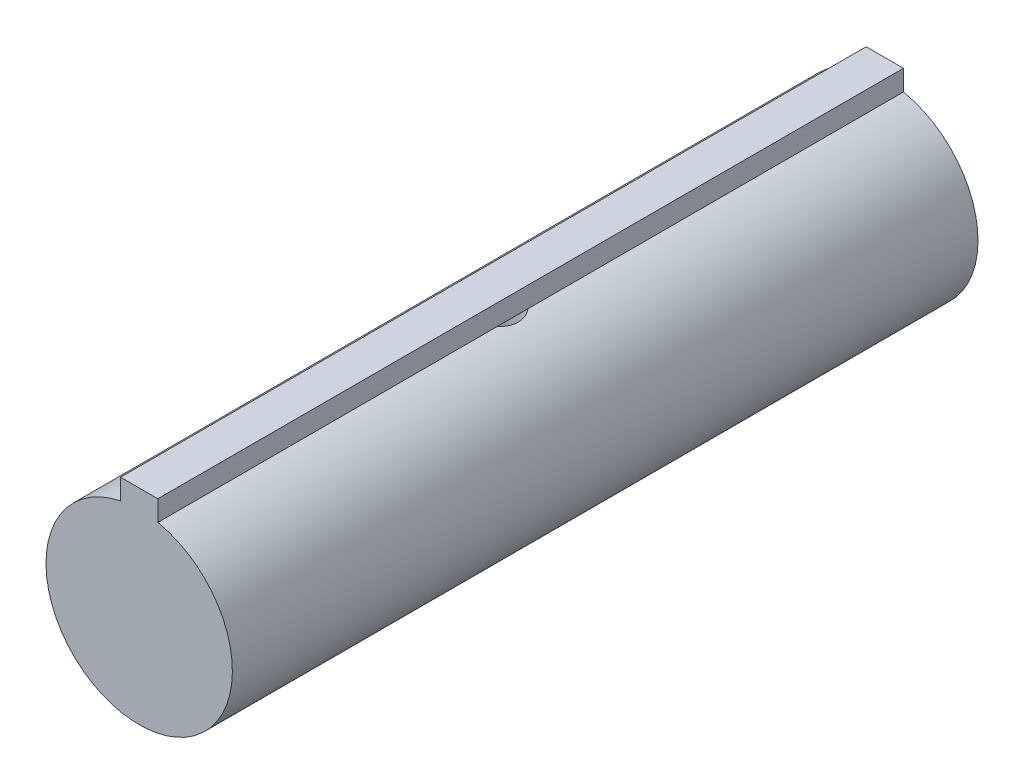
ISO-10303-21;
HEADER;
FILE_DESCRIPTION(('STEP AP214'),'2;1');
FILE_NAME('part.step','',(''),(''),'','','');
FILE_SCHEMA(('AUTOMOTIVE_DESIGN { 1 0 10303 214 1 1 1 1 }'));
ENDSEC;
DATA;
#1=APPLICATION_CONTEXT('core data for automotive mechanical design processes');
#2=APPLICATION_PROTOCOL_DEFINITION('international standard','automotive_design',2000,#1);
#3=PRODUCT_CONTEXT('',#1,'mechanical');
#4=PRODUCT('Part','Part','',(#3));
#5=PRODUCT_RELATED_PRODUCT_CATEGORY('part','',(#4));
#6=PRODUCT_DEFINITION_FORMATION('','',#4);
#7=PRODUCT_DEFINITION_CONTEXT('part definition',#1,'design');
#8=PRODUCT_DEFINITION('design','',#6,#7);
#9=PRODUCT_DEFINITION_SHAPE('','',#8);
#10=(LENGTH_UNIT() NAMED_UNIT(*) SI_UNIT(.MILLI.,.METRE.));
#11=(NAMED_UNIT(*) PLANE_ANGLE_UNIT() SI_UNIT($,.RADIAN.));
#12=(NAMED_UNIT(*) SI_UNIT($,.STERADIAN.) SOLID_ANGLE_UNIT());
#13=UNCERTAINTY_MEASURE_WITH_UNIT(LENGTH_MEASURE(1.E-05),#10,'distance_accuracy_value','');
#14=(GEOMETRIC_REPRESENTATION_CONTEXT(3) GLOBAL_UNCERTAINTY_ASSIGNED_CONTEXT((#13)) GLOBAL_UNIT_ASSIGNED_CONTEXT((#10,
#11,#12)) REPRESENTATION_CONTEXT('',''));
#15=CARTESIAN_POINT('',(0.,0.,0.));
#16=DIRECTION('',(0.,0.,1.));
#17=DIRECTION('',(1.,0.,0.));
#18=AXIS2_PLACEMENT_3D('',#15,#16,#17);
#19=CARTESIAN_POINT('',(0.,0.,50.8));
#20=DIRECTION('',(0.,0.,-1.));
#21=DIRECTION('',(-1.,0.,0.));
#22=AXIS2_PLACEMENT_3D('',#19,#20,#21);
#23=CYLINDRICAL_SURFACE('',#22,6.35);
#24=CARTESIAN_POINT('',(0.,-6.35,28.2670650920826));
#25=CARTESIAN_POINT('',(0.0906831957061342,-6.34999854513092,28.2670627441232));
#26=CARTESIAN_POINT('',(0.181392048753466,-6.34803822343501,28.2595331300205));
#27=CARTESIAN_POINT('',(0.360203098721544,-6.34040828162838,28.2296629729058));
#28=CARTESIAN_POINT('',(0.448303909072644,-6.33473672418082,28.2073146941831));
#29=CARTESIAN_POINT('',(0.619291440774945,-6.3203112871428,28.1485775899334));
#30=CARTESIAN_POINT('',(0.702184514774301,-6.31156125238741,28.1122062729401));
#31=CARTESIAN_POINT('',(0.860693455822149,-6.291907018305,28.0265188654484));
#32=CARTESIAN_POINT('',(0.936308951541479,-6.28100270914545,27.9772021149039));
#33=CARTESIAN_POINT('',(1.07977563095004,-6.25795279850893,27.8658808847737));
#34=CARTESIAN_POINT('',(1.14744435512863,-6.24578696357314,27.8036454393284));
#35=CARTESIAN_POINT('',(1.27150976944449,-6.22171723522909,27.668747553708));
#36=CARTESIAN_POINT('',(1.32790509630264,-6.20981337365568,27.5960838542791));
#37=CARTESIAN_POINT('',(1.42869730086755,-6.18740987129905,27.4409548153361));
#38=CARTESIAN_POINT('',(1.47288706644381,-6.17693583594577,27.3583508727409));
#39=CARTESIAN_POINT('',(1.5466807696668,-6.15887423448843,27.1865714978523));
#40=CARTESIAN_POINT('',(1.57628722348121,-6.1512861704977,27.0973972022453));
#41=CARTESIAN_POINT('',(1.61944560215556,-6.1400641103433,26.9170223314017));
#42=CARTESIAN_POINT('',(1.63332702906515,-6.13634909642026,26.8259057568739));
#43=CARTESIAN_POINT('',(1.64566814597715,-6.13305148746507,26.6425672033898));
#44=CARTESIAN_POINT('',(1.64413053684996,-6.13346816870573,26.5503454208535));
#45=CARTESIAN_POINT('',(1.62593944613642,-6.13831420728954,26.3699636128618));
#46=CARTESIAN_POINT('',(1.60968173081754,-6.14263849828476,26.2817604075932));
#47=CARTESIAN_POINT('',(1.5631445741932,-6.15464466729036,26.1093781312254));
#48=CARTESIAN_POINT('',(1.53286407065867,-6.16232679965542,26.0251993655113));
#49=CARTESIAN_POINT('',(1.45881132232561,-6.18027739644019,25.8622096592555));
#50=CARTESIAN_POINT('',(1.41489798784082,-6.1905726918315,25.7834659008676));
#51=CARTESIAN_POINT('',(1.31492465940198,-6.21257482460479,25.634324445159));
#52=CARTESIAN_POINT('',(1.25886240130194,-6.22428192491857,25.5639283073394));
#53=CARTESIAN_POINT('',(1.13414631567099,-6.24822834395266,25.4312158888331));
#54=CARTESIAN_POINT('',(1.06515934945343,-6.26047297981887,25.3692132158743));
#55=CARTESIAN_POINT('',(0.917618520510204,-6.2837923202748,25.2575949450211));
#56=CARTESIAN_POINT('',(0.839064323126651,-6.29486698391406,25.2079797806221));
#57=CARTESIAN_POINT('',(0.674151644641129,-6.31466026608454,25.1224179427156));
#58=CARTESIAN_POINT('',(0.587763977978468,-6.32336954672512,25.0865252208753));
#59=CARTESIAN_POINT('',(0.409904620675962,-6.33738309178574,25.0298607931243));
#60=CARTESIAN_POINT('',(0.318433978326136,-6.34268805548572,25.0090859817295));
#61=CARTESIAN_POINT('',(0.135683923769254,-6.34919057935194,24.9837330151035));
#62=CARTESIAN_POINT('',(0.0444674693104987,-6.35049632280729,24.9787281550503));
#63=CARTESIAN_POINT('',(-0.137500542198514,-6.34916291859566,24.9838826405469));
#64=CARTESIAN_POINT('',(-0.228252143443895,-6.34652415320328,24.9940405166287));
#65=CARTESIAN_POINT('',(-0.405210706696877,-6.33766784397545,25.0288812693986));
#66=CARTESIAN_POINT('',(-0.491467204941279,-6.33150835785606,25.0533286521607));
#67=CARTESIAN_POINT('',(-0.658648354630883,-6.31630703462156,25.1157831371963));
#68=CARTESIAN_POINT('',(-0.739572445286719,-6.30726489493047,25.1537916629569));
#69=CARTESIAN_POINT('',(-0.895468795504344,-6.2870450305439,25.2430980041504));
#70=CARTESIAN_POINT('',(-0.970301292534623,-6.27583049934242,25.2946312560764));
#71=CARTESIAN_POINT('',(-1.1104070912456,-6.25256335725948,25.4092258677128));
#72=CARTESIAN_POINT('',(-1.17567861522559,-6.2405105911353,25.4722893663887));
#73=CARTESIAN_POINT('',(-1.2965887987847,-6.21653146602868,25.6101410292649));
#74=CARTESIAN_POINT('',(-1.35192719462355,-6.20461687158997,25.6851950698932));
#75=CARTESIAN_POINT('',(-1.44922695760324,-6.18261588714623,25.8437731011825));
#76=CARTESIAN_POINT('',(-1.49118890436347,-6.17252941793428,25.9272967246383));
#77=CARTESIAN_POINT('',(-1.56022923372261,-6.15544070250996,26.1000085519629));
#78=CARTESIAN_POINT('',(-1.58739517045231,-6.14842036283226,26.1891598711746));
#79=CARTESIAN_POINT('',(-1.6262917658096,-6.13824787194154,26.370975865082));
#80=CARTESIAN_POINT('',(-1.63802609155514,-6.13509480173516,26.463639699688));
#81=CARTESIAN_POINT('',(-1.64552460653892,-6.13308741737197,26.6467853548608));
#82=CARTESIAN_POINT('',(-1.64177007004377,-6.13410355113704,26.7372463551505));
#83=CARTESIAN_POINT('',(-1.61950665314897,-6.14001858307302,26.9161981632885));
#84=CARTESIAN_POINT('',(-1.60099811135644,-6.14491739213581,27.0046890163041));
#85=CARTESIAN_POINT('',(-1.55002344888557,-6.15797101935051,27.17662255738));
#86=CARTESIAN_POINT('',(-1.51765367936512,-6.1661033336089,27.2600956389457));
#87=CARTESIAN_POINT('',(-1.4399507955695,-6.18470942406868,27.4204877508018));
#88=CARTESIAN_POINT('',(-1.39461575875538,-6.19518354747209,27.497405806891));
#89=CARTESIAN_POINT('',(-1.29078653095523,-6.21765723266004,27.6448154326551));
#90=CARTESIAN_POINT('',(-1.23196124681242,-6.22969113387767,27.7150685933009));
#91=CARTESIAN_POINT('',(-1.10345852414889,-6.2537304519553,27.8448629169271));
#92=CARTESIAN_POINT('',(-1.03377848212917,-6.2657358612784,27.9044015026283));
#93=CARTESIAN_POINT('',(-0.883880159176993,-6.28864931897162,28.012230338614));
#94=CARTESIAN_POINT('',(-0.803480633115281,-6.29953095212458,28.0602746958534));
#95=CARTESIAN_POINT('',(-0.635469172296466,-6.31868696855442,28.1420892266105));
#96=CARTESIAN_POINT('',(-0.547862176002295,-6.32696311861359,28.175869078241));
#97=CARTESIAN_POINT('',(-0.383747545800924,-6.33883126954559,28.2234955259927));
#98=CARTESIAN_POINT('',(-0.307984146680775,-6.34298987318282,28.2397974483192));
#99=CARTESIAN_POINT('',(-0.154819970035105,-6.34857474076044,28.2615827637031));
#100=CARTESIAN_POINT('',(-0.0774193353466813,-6.35000124207133,28.2670670966155));
#101=CARTESIAN_POINT('',(0.,-6.35,28.2670650920826));
#102=B_SPLINE_CURVE_WITH_KNOTS('',3,(#24,#25,#26,#27,#28,#29,#30,#31,#32,#33,#34,#35,#36,#37,
#38,#39,#40,#41,#42,#43,#44,#45,#46,#47,#48,#49,#50,#51,#52,#53,#54,#55,#56,#57,#58,#59,#60,#61,
#62,#63,#64,#65,#66,#67,#68,#69,#70,#71,#72,#73,#74,#75,#76,#77,#78,#79,#80,#81,#82,#83,#84,#85,
#86,#87,#88,#89,#90,#91,#92,#93,#94,#95,#96,#97,#98,#99,#100,#101),.UNSPECIFIED.,.T.,.F.,(4,2,2,
2,2,2,2,2,2,2,2,2,2,2,2,2,2,2,2,2,2,2,2,2,2,2,2,2,2,2,2,2,2,2,2,2,2,2,4),(0.,0.271765768938539,
0.543673518161629,0.815242869307136,1.08682606959506,1.36376342590829,1.64073425170854,
1.92215064869555,2.2035184737876,2.47887466039206,2.75418261516246,3.02230150745154,
3.29044071312419,3.56145307674212,3.83251599134661,4.1118832311613,4.39126024593755,
4.67172464270549,4.95213141089231,5.22488271374742,5.49760758513975,5.76595979554398,
6.03434018265312,6.30774421268334,6.581199013202,6.86188272987305,7.14255428249045,
7.42154642403746,7.7004722548102,7.9707975526337,8.24111664662059,8.5095864653483,
8.77809611445754,9.05407804087364,9.33012626338796,9.61163688269507,9.89295619596067,
10.1249920573977,10.3570077581829),.UNSPECIFIED.);
#103=CARTESIAN_POINT('',(0.,-6.35,28.2670650920826));
#104=VERTEX_POINT('',#103);
#105=EDGE_CURVE('E11',#104,#104,#102,.T.);
#106=ORIENTED_EDGE('',*,*,#105,.T.);
#107=EDGE_LOOP('',(#106));
#108=FACE_BOUND('',#107,.T.);
#109=CARTESIAN_POINT('',(0.,0.,0.));
#110=DIRECTION('',(0.,0.,1.));
#111=DIRECTION('',(1.,0.,0.));
#112=AXIS2_PLACEMENT_3D('',#109,#110,#111);
#113=CIRCLE('',#112,6.35);
#114=CARTESIAN_POINT('',(-1.27,6.22170394666927,0.));
#115=VERTEX_POINT('',#114);
#116=CARTESIAN_POINT('',(1.27,6.22170394666927,0.));
#117=VERTEX_POINT('',#116);
#118=EDGE_CURVE('E110',#115,#117,#113,.T.);
#119=ORIENTED_EDGE('',*,*,#118,.T.);
#120=DIRECTION('',(0.,0.,1.));
#121=VECTOR('',#120,1.);
#122=CARTESIAN_POINT('',(1.27,6.22170394666927,0.));
#123=LINE('',#122,#121);
#124=CARTESIAN_POINT('',(1.27,6.22170394666927,25.5811497893374));
#125=VERTEX_POINT('',#124);
#126=EDGE_CURVE('E124',#117,#125,#123,.T.);
#127=ORIENTED_EDGE('',*,*,#126,.T.);
#128=CARTESIAN_POINT('',(0.,6.35,28.2670650920826));
#129=CARTESIAN_POINT('',(-0.0906831957061342,6.34999854513092,28.2670627441232));
#130=CARTESIAN_POINT('',(-0.181392048753466,6.34803822343501,28.2595331300205));
#131=CARTESIAN_POINT('',(-0.360203098721544,6.34040828162838,28.2296629729058));
#132=CARTESIAN_POINT('',(-0.448303909072644,6.33473672418082,28.2073146941831));
#133=CARTESIAN_POINT('',(-0.619291440774945,6.3203112871428,28.1485775899334));
#134=CARTESIAN_POINT('',(-0.702184514774301,6.31156125238741,28.1122062729401));
#135=CARTESIAN_POINT('',(-0.860693455822149,6.291907018305,28.0265188654484));
#136=CARTESIAN_POINT('',(-0.936308951541479,6.28100270914545,27.9772021149039));
#137=CARTESIAN_POINT('',(-1.07977563095004,6.25795279850893,27.8658808847737));
#138=CARTESIAN_POINT('',(-1.14744435512863,6.24578696357314,27.8036454393284));
#139=CARTESIAN_POINT('',(-1.27150976944449,6.22171723522909,27.668747553708));
#140=CARTESIAN_POINT('',(-1.32790509630264,6.20981337365568,27.5960838542791));
#141=CARTESIAN_POINT('',(-1.42869730086755,6.18740987129905,27.4409548153361));
#142=CARTESIAN_POINT('',(-1.47288706644381,6.17693583594577,27.3583508727409));
#143=CARTESIAN_POINT('',(-1.5466807696668,6.15887423448843,27.1865714978523));
#144=CARTESIAN_POINT('',(-1.57628722348121,6.1512861704977,27.0973972022453));
#145=CARTESIAN_POINT('',(-1.61944560215556,6.1400641103433,26.9170223314017));
#146=CARTESIAN_POINT('',(-1.63332702906515,6.13634909642026,26.8259057568739));
#147=CARTESIAN_POINT('',(-1.64566814597715,6.13305148746507,26.6425672033898));
#148=CARTESIAN_POINT('',(-1.64413053684996,6.13346816870573,26.5503454208535));
#149=CARTESIAN_POINT('',(-1.62593944613642,6.13831420728954,26.3699636128618));
#150=CARTESIAN_POINT('',(-1.60968173081754,6.14263849828476,26.2817604075932));
#151=CARTESIAN_POINT('',(-1.5631445741932,6.15464466729036,26.1093781312254));
#152=CARTESIAN_POINT('',(-1.53286407065867,6.16232679965542,26.0251993655113));
#153=CARTESIAN_POINT('',(-1.45881132232561,6.18027739644019,25.8622096592555));
#154=CARTESIAN_POINT('',(-1.41489798784082,6.1905726918315,25.7834659008676));
#155=CARTESIAN_POINT('',(-1.31492465940198,6.21257482460479,25.634324445159));
#156=CARTESIAN_POINT('',(-1.25886240130194,6.22428192491857,25.5639283073394));
#157=CARTESIAN_POINT('',(-1.13414631567099,6.24822834395266,25.4312158888331));
#158=CARTESIAN_POINT('',(-1.06515934945343,6.26047297981887,25.3692132158743));
#159=CARTESIAN_POINT('',(-0.917618520510204,6.2837923202748,25.2575949450211));
#160=CARTESIAN_POINT('',(-0.839064323126651,6.29486698391406,25.2079797806221));
#161=CARTESIAN_POINT('',(-0.674151644641129,6.31466026608454,25.1224179427156));
#162=CARTESIAN_POINT('',(-0.587763977978468,6.32336954672512,25.0865252208753));
#163=CARTESIAN_POINT('',(-0.409904620675962,6.33738309178574,25.0298607931243));
#164=CARTESIAN_POINT('',(-0.318433978326136,6.34268805548572,25.0090859817295));
#165=CARTESIAN_POINT('',(-0.135683923769254,6.34919057935194,24.9837330151035));
#166=CARTESIAN_POINT('',(-0.0444674693104987,6.35049632280729,24.9787281550503));
#167=CARTESIAN_POINT('',(0.137500542198514,6.34916291859566,24.9838826405469));
#168=CARTESIAN_POINT('',(0.228252143443895,6.34652415320328,24.9940405166287));
#169=CARTESIAN_POINT('',(0.405210706696877,6.33766784397545,25.0288812693986));
#170=CARTESIAN_POINT('',(0.491467204941279,6.33150835785606,25.0533286521607));
#171=CARTESIAN_POINT('',(0.658648354630883,6.31630703462156,25.1157831371963));
#172=CARTESIAN_POINT('',(0.739572445286719,6.30726489493047,25.1537916629569));
#173=CARTESIAN_POINT('',(0.895468795504344,6.2870450305439,25.2430980041504));
#174=CARTESIAN_POINT('',(0.970301292534623,6.27583049934242,25.2946312560764));
#175=CARTESIAN_POINT('',(1.1104070912456,6.25256335725948,25.4092258677128));
#176=CARTESIAN_POINT('',(1.17567861522559,6.2405105911353,25.4722893663887));
#177=CARTESIAN_POINT('',(1.2965887987847,6.21653146602868,25.6101410292649));
#178=CARTESIAN_POINT('',(1.35192719462355,6.20461687158997,25.6851950698932));
#179=CARTESIAN_POINT('',(1.44922695760324,6.18261588714623,25.8437731011825));
#180=CARTESIAN_POINT('',(1.49118890436347,6.17252941793428,25.9272967246383));
#181=CARTESIAN_POINT('',(1.56022923372261,6.15544070250996,26.1000085519629));
#182=CARTESIAN_POINT('',(1.58739517045231,6.14842036283226,26.1891598711746));
#183=CARTESIAN_POINT('',(1.6262917658096,6.13824787194154,26.370975865082));
#184=CARTESIAN_POINT('',(1.63802609155514,6.13509480173516,26.463639699688));
#185=CARTESIAN_POINT('',(1.64552460653892,6.13308741737197,26.6467853548608));
#186=CARTESIAN_POINT('',(1.64177007004377,6.13410355113704,26.7372463551505));
#187=CARTESIAN_POINT('',(1.61950665314897,6.14001858307302,26.9161981632885));
#188=CARTESIAN_POINT('',(1.60099811135644,6.14491739213581,27.0046890163041));
#189=CARTESIAN_POINT('',(1.55002344888557,6.15797101935051,27.17662255738));
#190=CARTESIAN_POINT('',(1.51765367936512,6.1661033336089,27.2600956389457));
#191=CARTESIAN_POINT('',(1.4399507955695,6.18470942406868,27.4204877508018));
#192=CARTESIAN_POINT('',(1.39461575875538,6.19518354747209,27.497405806891));
#193=CARTESIAN_POINT('',(1.29078653095523,6.21765723266004,27.6448154326551));
#194=CARTESIAN_POINT('',(1.23196124681242,6.22969113387767,27.7150685933009));
#195=CARTESIAN_POINT('',(1.10345852414889,6.2537304519553,27.8448629169271));
#196=CARTESIAN_POINT('',(1.03377848212917,6.2657358612784,27.9044015026283));
#197=CARTESIAN_POINT('',(0.883880159176993,6.28864931897162,28.012230338614));
#198=CARTESIAN_POINT('',(0.803480633115281,6.29953095212458,28.0602746958534));
#199=CARTESIAN_POINT('',(0.635469172296466,6.31868696855442,28.1420892266105));
#200=CARTESIAN_POINT('',(0.547862176002295,6.32696311861359,28.175869078241));
#201=CARTESIAN_POINT('',(0.383747545800924,6.33883126954559,28.2234955259927));
#202=CARTESIAN_POINT('',(0.307984146680775,6.34298987318282,28.2397974483192));
#203=CARTESIAN_POINT('',(0.154819970035105,6.34857474076044,28.2615827637031));
#204=CARTESIAN_POINT('',(0.0774193353466813,6.35000124207133,28.2670670966155));
#205=CARTESIAN_POINT('',(0.,6.35,28.2670650920826));
#206=B_SPLINE_CURVE_WITH_KNOTS('',3,(#128,#129,#130,#131,#132,#133,#134,#135,#136,#137,#138,
#139,#140,#141,#142,#143,#144,#145,#146,#147,#148,#149,#150,#151,#152,#153,#154,#155,#156,#157,
#158,#159,#160,#161,#162,#163,#164,#165,#166,#167,#168,#169,#170,#171,#172,#173,#174,#175,#176,
#177,#178,#179,#180,#181,#182,#183,#184,#185,#186,#187,#188,#189,#190,#191,#192,#193,#194,#195,
#196,#197,#198,#199,#200,#201,#202,#203,#204,#205),.UNSPECIFIED.,.T.,.F.,(4,2,2,2,2,2,2,2,2,2,2,
2,2,2,2,2,2,2,2,2,2,2,2,2,2,2,2,2,2,2,2,2,2,2,2,2,2,2,4),(0.,0.271765768938539,
0.543673518161629,0.815242869307136,1.08682606959506,1.36376342590829,1.64073425170854,
1.92215064869555,2.2035184737876,2.47887466039206,2.75418261516246,3.02230150745154,
3.29044071312419,3.56145307674212,3.83251599134661,4.1118832311613,4.39126024593755,
4.67172464270549,4.95213141089231,5.22488271374742,5.49760758513975,5.76595979554398,
6.03434018265312,6.30774421268334,6.581199013202,6.86188272987305,7.14255428249045,
7.42154642403746,7.7004722548102,7.9707975526337,8.24111664662059,8.5095864653483,
8.77809611445754,9.05407804087364,9.33012626338796,9.61163688269507,9.89295619596067,
10.1249920573977,10.3570077581829),.UNSPECIFIED.);
#207=CARTESIAN_POINT('',(1.27,6.22170394666927,27.6665621654447));
#208=VERTEX_POINT('',#207);
#209=EDGE_CURVE('E168',#125,#208,#206,.T.);
#210=ORIENTED_EDGE('',*,*,#209,.T.);
#211=CARTESIAN_POINT('',(1.27,6.22170394666927,50.8));
#212=VERTEX_POINT('',#211);
#213=EDGE_CURVE('E56',#208,#212,#123,.T.);
#214=ORIENTED_EDGE('',*,*,#213,.T.);
#215=CARTESIAN_POINT('',(0.,0.,50.8));
#216=DIRECTION('',(0.,0.,1.));
#217=DIRECTION('',(1.,0.,0.));
#218=AXIS2_PLACEMENT_3D('',#215,#216,#217);
#219=CIRCLE('',#218,6.35);
#220=CARTESIAN_POINT('',(-1.27,6.22170394666927,50.8));
#221=VERTEX_POINT('',#220);
#222=EDGE_CURVE('E51',#221,#212,#219,.T.);
#223=ORIENTED_EDGE('',*,*,#222,.F.);
#224=DIRECTION('',(0.,0.,1.));
#225=VECTOR('',#224,1.);
#226=CARTESIAN_POINT('',(-1.27,6.22170394666927,0.));
#227=LINE('',#226,#225);
#228=CARTESIAN_POINT('',(-1.27,6.22170394666927,27.6665621654447));
#229=VERTEX_POINT('',#228);
#230=EDGE_CURVE('E100',#229,#221,#227,.T.);
#231=ORIENTED_EDGE('',*,*,#230,.F.);
#232=CARTESIAN_POINT('',(-1.2700000000001,6.22170394666926,25.5811497893373));
#233=VERTEX_POINT('',#232);
#234=EDGE_CURVE('E44',#229,#233,#206,.T.);
#235=ORIENTED_EDGE('',*,*,#234,.T.);
#236=EDGE_CURVE('E128',#115,#233,#227,.T.);
#237=ORIENTED_EDGE('',*,*,#236,.F.);
#238=EDGE_LOOP('',(#119,#127,#210,#214,#223,#231,#235,#237));
#239=FACE_BOUND('',#238,.T.);
#240=ADVANCED_FACE('F33',(#108,#239),#23,.T.);
#241=CARTESIAN_POINT('',(0.,0.,50.8));
#242=DIRECTION('',(0.,0.,1.));
#243=DIRECTION('',(1.,0.,0.));
#244=AXIS2_PLACEMENT_3D('',#241,#242,#243);
#245=PLANE('',#244);
#246=ORIENTED_EDGE('',*,*,#222,.T.);
#247=DIRECTION('',(0.,1.,0.));
#248=VECTOR('',#247,1.);
#249=CARTESIAN_POINT('',(1.27,7.62,50.8));
#250=LINE('',#249,#248);
#251=CARTESIAN_POINT('',(1.27,7.62,50.8));
#252=VERTEX_POINT('',#251);
#253=EDGE_CURVE('E114',#212,#252,#250,.T.);
#254=ORIENTED_EDGE('',*,*,#253,.T.);
#255=DIRECTION('',(-1.,0.,0.));
#256=VECTOR('',#255,1.);
#257=CARTESIAN_POINT('',(-1.27,7.62,50.8));
#258=LINE('',#257,#256);
#259=CARTESIAN_POINT('',(-1.27,7.62,50.8));
#260=VERTEX_POINT('',#259);
#261=EDGE_CURVE('E120',#252,#260,#258,.T.);
#262=ORIENTED_EDGE('',*,*,#261,.T.);
#263=DIRECTION('',(0.,-1.,0.));
#264=VECTOR('',#263,1.);
#265=CARTESIAN_POINT('',(-1.27,6.22170394666927,50.8));
#266=LINE('',#265,#264);
#267=EDGE_CURVE('E95',#260,#221,#266,.T.);
#268=ORIENTED_EDGE('',*,*,#267,.T.);
#269=EDGE_LOOP('',(#246,#254,#262,#268));
#270=FACE_BOUND('',#269,.T.);
#271=ADVANCED_FACE('F145',(#270),#245,.T.);
#272=CARTESIAN_POINT('',(0.,0.,0.));
#273=DIRECTION('',(0.,0.,1.));
#274=DIRECTION('',(1.,0.,0.));
#275=AXIS2_PLACEMENT_3D('',#272,#273,#274);
#276=PLANE('',#275);
#277=ORIENTED_EDGE('',*,*,#118,.F.);
#278=DIRECTION('',(0.,-1.,0.));
#279=VECTOR('',#278,1.);
#280=CARTESIAN_POINT('',(-1.27,6.22170394666927,0.));
#281=LINE('',#280,#279);
#282=CARTESIAN_POINT('',(-1.27,7.62,0.));
#283=VERTEX_POINT('',#282);
#284=EDGE_CURVE('E93',#283,#115,#281,.T.);
#285=ORIENTED_EDGE('',*,*,#284,.F.);
#286=DIRECTION('',(-1.,0.,0.));
#287=VECTOR('',#286,1.);
#288=CARTESIAN_POINT('',(-1.27,7.62,0.));
#289=LINE('',#288,#287);
#290=CARTESIAN_POINT('',(1.27,7.62,0.));
#291=VERTEX_POINT('',#290);
#292=EDGE_CURVE('E108',#291,#283,#289,.T.);
#293=ORIENTED_EDGE('',*,*,#292,.F.);
#294=DIRECTION('',(0.,1.,0.));
#295=VECTOR('',#294,1.);
#296=CARTESIAN_POINT('',(1.27,7.62,0.));
#297=LINE('',#296,#295);
#298=EDGE_CURVE('E101',#117,#291,#297,.T.);
#299=ORIENTED_EDGE('',*,*,#298,.F.);
#300=EDGE_LOOP('',(#277,#285,#293,#299));
#301=FACE_BOUND('',#300,.T.);
#302=ADVANCED_FACE('F106',(#301),#276,.F.);
#303=CARTESIAN_POINT('',(0.,-6.35,26.623855977391));
#304=DIRECTION('',(0.,1.,0.));
#305=DIRECTION('',(0.,0.,1.));
#306=AXIS2_PLACEMENT_3D('',#303,#304,#305);
#307=CYLINDRICAL_SURFACE('',#306,1.64320911469154);
#308=ORIENTED_EDGE('',*,*,#234,.F.);
#309=EDGE_CURVE('E132',#208,#229,#206,.T.);
#310=ORIENTED_EDGE('',*,*,#309,.F.);
#311=ORIENTED_EDGE('',*,*,#209,.F.);
#312=EDGE_CURVE('E136',#233,#125,#206,.T.);
#313=ORIENTED_EDGE('',*,*,#312,.F.);
#314=EDGE_LOOP('',(#308,#310,#311,#313));
#315=FACE_BOUND('',#314,.T.);
#316=ORIENTED_EDGE('',*,*,#105,.F.);
#317=EDGE_LOOP('',(#316));
#318=FACE_BOUND('',#317,.T.);
#319=ADVANCED_FACE('F137',(#315,#318),#307,.F.);
#320=CARTESIAN_POINT('',(0.,0.,0.));
#321=DIRECTION('',(0.,0.,1.));
#322=DIRECTION('',(1.,0.,0.));
#323=AXIS2_PLACEMENT_3D('',#320,#321,#322);
#324=CYLINDRICAL_SURFACE('',#323,6.35);
#325=ORIENTED_EDGE('',*,*,#312,.T.);
#326=EDGE_CURVE('E127',#125,#208,#123,.T.);
#327=ORIENTED_EDGE('',*,*,#326,.T.);
#328=ORIENTED_EDGE('',*,*,#309,.T.);
#329=EDGE_CURVE('E129',#233,#229,#227,.T.);
#330=ORIENTED_EDGE('',*,*,#329,.F.);
#331=EDGE_LOOP('',(#325,#327,#328,#330));
#332=FACE_BOUND('',#331,.T.);
#333=ADVANCED_FACE('F142',(#332),#324,.F.);
#334=CARTESIAN_POINT('',(-1.27,7.62,0.));
#335=DIRECTION('',(0.,1.,0.));
#336=DIRECTION('',(0.,0.,1.));
#337=AXIS2_PLACEMENT_3D('',#334,#335,#336);
#338=PLANE('',#337);
#339=ORIENTED_EDGE('',*,*,#261,.F.);
#340=DIRECTION('',(0.,0.,1.));
#341=VECTOR('',#340,1.);
#342=CARTESIAN_POINT('',(1.27,7.62,0.));
#343=LINE('',#342,#341);
#344=EDGE_CURVE('E113',#291,#252,#343,.T.);
#345=ORIENTED_EDGE('',*,*,#344,.F.);
#346=ORIENTED_EDGE('',*,*,#292,.T.);
#347=DIRECTION('',(0.,0.,1.));
#348=VECTOR('',#347,1.);
#349=CARTESIAN_POINT('',(-1.27,7.62,0.));
#350=LINE('',#349,#348);
#351=EDGE_CURVE('E89',#283,#260,#350,.T.);
#352=ORIENTED_EDGE('',*,*,#351,.T.);
#353=EDGE_LOOP('',(#339,#345,#346,#352));
#354=FACE_BOUND('',#353,.T.);
#355=ADVANCED_FACE('F112',(#354),#338,.T.);
#356=CARTESIAN_POINT('',(1.27,7.62,0.));
#357=DIRECTION('',(1.,0.,0.));
#358=DIRECTION('',(0.,1.,0.));
#359=AXIS2_PLACEMENT_3D('',#356,#357,#358);
#360=PLANE('',#359);
#361=ORIENTED_EDGE('',*,*,#253,.F.);
#362=ORIENTED_EDGE('',*,*,#213,.F.);
#363=ORIENTED_EDGE('',*,*,#326,.F.);
#364=ORIENTED_EDGE('',*,*,#126,.F.);
#365=ORIENTED_EDGE('',*,*,#298,.T.);
#366=ORIENTED_EDGE('',*,*,#344,.T.);
#367=EDGE_LOOP('',(#361,#362,#363,#364,#365,#366));
#368=FACE_BOUND('',#367,.T.);
#369=ADVANCED_FACE('F162',(#368),#360,.T.);
#370=CARTESIAN_POINT('',(-1.27,6.22170394666927,0.));
#371=DIRECTION('',(-1.,0.,0.));
#372=DIRECTION('',(0.,-1.,0.));
#373=AXIS2_PLACEMENT_3D('',#370,#371,#372);
#374=PLANE('',#373);
#375=ORIENTED_EDGE('',*,*,#267,.F.);
#376=ORIENTED_EDGE('',*,*,#351,.F.);
#377=ORIENTED_EDGE('',*,*,#284,.T.);
#378=ORIENTED_EDGE('',*,*,#236,.T.);
#379=ORIENTED_EDGE('',*,*,#329,.T.);
#380=ORIENTED_EDGE('',*,*,#230,.T.);
#381=EDGE_LOOP('',(#375,#376,#377,#378,#379,#380));
#382=FACE_BOUND('',#381,.T.);
#383=ADVANCED_FACE('F91',(#382),#374,.T.);
#384=CLOSED_SHELL('',(#240,#271,#302,#319,#333,#355,#369,#383));
#385=MANIFOLD_SOLID_BREP('B2',#384);
#386=ADVANCED_BREP_SHAPE_REPRESENTATION('',(#18,#385),#14);
#387=SHAPE_DEFINITION_REPRESENTATION(#9,#386);
ENDSEC;
END-ISO-10303-21;
